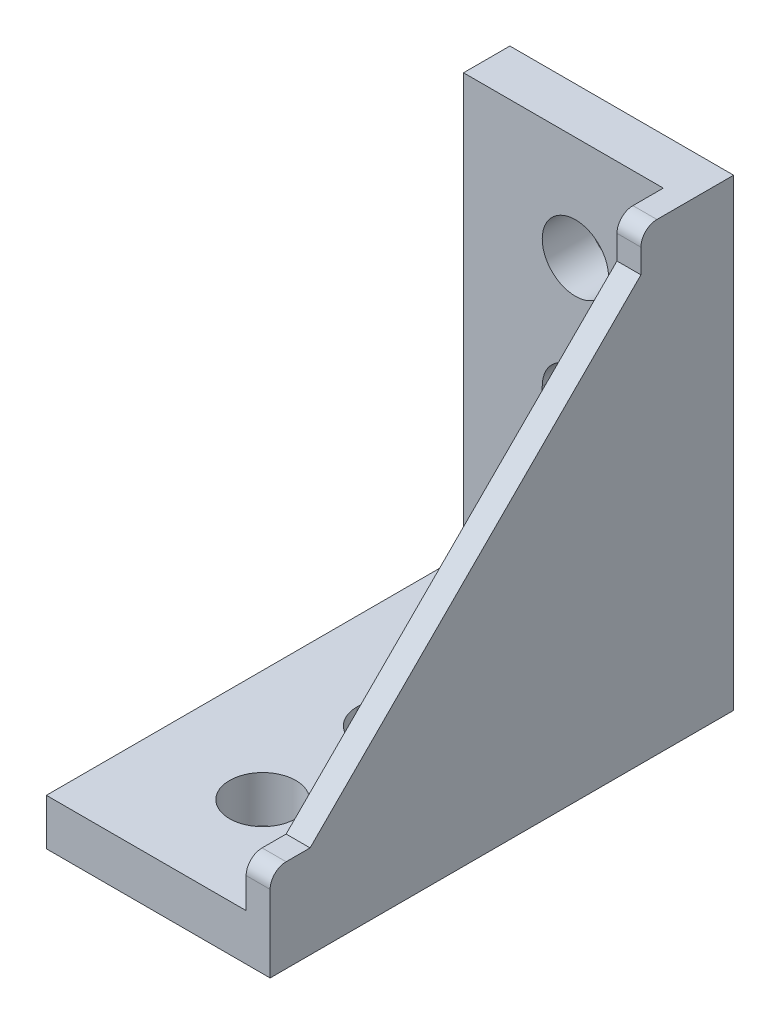
ISO-10303-21;
HEADER;
FILE_DESCRIPTION(('STEP AP214'),'2;1');
FILE_NAME('part.step','',(''),(''),'','','');
FILE_SCHEMA(('AUTOMOTIVE_DESIGN { 1 0 10303 214 1 1 1 1 }'));
ENDSEC;
DATA;
#1=APPLICATION_CONTEXT('core data for automotive mechanical design processes');
#2=APPLICATION_PROTOCOL_DEFINITION('international standard','automotive_design',2000,#1);
#3=PRODUCT_CONTEXT('',#1,'mechanical');
#4=PRODUCT('Part','Part','',(#3));
#5=PRODUCT_RELATED_PRODUCT_CATEGORY('part','',(#4));
#6=PRODUCT_DEFINITION_FORMATION('','',#4);
#7=PRODUCT_DEFINITION_CONTEXT('part definition',#1,'design');
#8=PRODUCT_DEFINITION('design','',#6,#7);
#9=PRODUCT_DEFINITION_SHAPE('','',#8);
#10=(LENGTH_UNIT() NAMED_UNIT(*) SI_UNIT(.MILLI.,.METRE.));
#11=(NAMED_UNIT(*) PLANE_ANGLE_UNIT() SI_UNIT($,.RADIAN.));
#12=(NAMED_UNIT(*) SI_UNIT($,.STERADIAN.) SOLID_ANGLE_UNIT());
#13=UNCERTAINTY_MEASURE_WITH_UNIT(LENGTH_MEASURE(1.E-05),#10,'distance_accuracy_value','');
#14=(GEOMETRIC_REPRESENTATION_CONTEXT(3) GLOBAL_UNCERTAINTY_ASSIGNED_CONTEXT((#13)) GLOBAL_UNIT_ASSIGNED_CONTEXT((#10,
#11,#12)) REPRESENTATION_CONTEXT('',''));
#15=CARTESIAN_POINT('',(0.,0.,0.));
#16=DIRECTION('',(0.,0.,1.));
#17=DIRECTION('',(1.,0.,0.));
#18=AXIS2_PLACEMENT_3D('',#15,#16,#17);
#19=CARTESIAN_POINT('',(14.,-29.,5.8));
#20=DIRECTION('',(0.,0.,1.));
#21=DIRECTION('',(1.,0.,0.));
#22=AXIS2_PLACEMENT_3D('',#19,#20,#21);
#23=PLANE('',#22);
#24=CARTESIAN_POINT('',(0.,15.929446332219,5.80000000000009));
#25=DIRECTION('',(0.,0.,-1.));
#26=DIRECTION('',(-1.,0.,0.));
#27=AXIS2_PLACEMENT_3D('',#24,#25,#26);
#28=CIRCLE('',#27,4.15);
#29=CARTESIAN_POINT('',(-4.15000000000002,15.929446332219,5.80000000000009));
#30=VERTEX_POINT('',#29);
#31=EDGE_CURVE('E201',#30,#30,#28,.T.);
#32=ORIENTED_EDGE('',*,*,#31,.T.);
#33=EDGE_LOOP('',(#32));
#34=FACE_BOUND('',#33,.T.);
#35=DIRECTION('',(0.,1.,0.));
#36=VECTOR('',#35,1.);
#37=CARTESIAN_POINT('',(11.,29.,5.8));
#38=LINE('',#37,#36);
#39=CARTESIAN_POINT('',(11.,-23.2,5.8));
#40=VERTEX_POINT('',#39);
#41=CARTESIAN_POINT('',(11.,29.,5.8));
#42=VERTEX_POINT('',#41);
#43=EDGE_CURVE('E249',#40,#42,#38,.T.);
#44=ORIENTED_EDGE('',*,*,#43,.T.);
#45=DIRECTION('',(-1.,0.,0.));
#46=VECTOR('',#45,1.);
#47=CARTESIAN_POINT('',(-14.,29.,5.8));
#48=LINE('',#47,#46);
#49=CARTESIAN_POINT('',(-14.,29.,5.8));
#50=VERTEX_POINT('',#49);
#51=EDGE_CURVE('E295',#42,#50,#48,.T.);
#52=ORIENTED_EDGE('',*,*,#51,.T.);
#53=DIRECTION('',(0.,-1.,0.));
#54=VECTOR('',#53,1.);
#55=CARTESIAN_POINT('',(-14.,29.,5.8));
#56=LINE('',#55,#54);
#57=CARTESIAN_POINT('',(-14.,-23.2,5.80000000000001));
#58=VERTEX_POINT('',#57);
#59=EDGE_CURVE('E297',#50,#58,#56,.T.);
#60=ORIENTED_EDGE('',*,*,#59,.T.);
#61=DIRECTION('',(-1.,0.,0.));
#62=VECTOR('',#61,1.);
#63=CARTESIAN_POINT('',(14.,-23.2,5.8));
#64=LINE('',#63,#62);
#65=EDGE_CURVE('E292',#40,#58,#64,.T.);
#66=ORIENTED_EDGE('',*,*,#65,.F.);
#67=EDGE_LOOP('',(#44,#52,#60,#66));
#68=FACE_BOUND('',#67,.T.);
#69=DIRECTION('',(0.,-1.,0.));
#70=VECTOR('',#69,1.);
#71=CARTESIAN_POINT('',(4.14999999999999,-11.7296029454166,5.80000000000003));
#72=LINE('',#71,#70);
#73=CARTESIAN_POINT('',(4.14999999999999,-0.0296029454166166,5.80000000000005));
#74=VERTEX_POINT('',#73);
#75=CARTESIAN_POINT('',(4.14999999999999,-11.7296029454166,5.8));
#76=VERTEX_POINT('',#75);
#77=EDGE_CURVE('E195',#74,#76,#72,.T.);
#78=ORIENTED_EDGE('',*,*,#77,.T.);
#79=CARTESIAN_POINT('',(0.,-11.7296029454166,5.80000000000003));
#80=DIRECTION('',(0.,0.,-1.));
#81=DIRECTION('',(-1.,0.,0.));
#82=AXIS2_PLACEMENT_3D('',#79,#80,#81);
#83=CIRCLE('',#82,4.15);
#84=CARTESIAN_POINT('',(-4.15000000000001,-11.7296029454166,5.80000000000003));
#85=VERTEX_POINT('',#84);
#86=EDGE_CURVE('E49',#76,#85,#83,.T.);
#87=ORIENTED_EDGE('',*,*,#86,.T.);
#88=DIRECTION('',(0.,1.,0.));
#89=VECTOR('',#88,1.);
#90=CARTESIAN_POINT('',(-4.15000000000001,-11.7296029454166,5.80000000000003));
#91=LINE('',#90,#89);
#92=CARTESIAN_POINT('',(-4.15000000000001,-0.0296029454166166,5.80000000000005));
#93=VERTEX_POINT('',#92);
#94=EDGE_CURVE('E186',#85,#93,#91,.T.);
#95=ORIENTED_EDGE('',*,*,#94,.T.);
#96=CARTESIAN_POINT('',(0.,-0.0296029454166166,5.80000000000005));
#97=DIRECTION('',(0.,0.,-1.));
#98=DIRECTION('',(-1.,0.,0.));
#99=AXIS2_PLACEMENT_3D('',#96,#97,#98);
#100=CIRCLE('',#99,4.15);
#101=EDGE_CURVE('E189',#93,#74,#100,.T.);
#102=ORIENTED_EDGE('',*,*,#101,.T.);
#103=EDGE_LOOP('',(#78,#87,#95,#102));
#104=FACE_BOUND('',#103,.T.);
#105=ADVANCED_FACE('F34',(#34,#68,#104),#23,.T.);
#106=CARTESIAN_POINT('',(14.,-29.,0.));
#107=DIRECTION('',(0.,0.,1.));
#108=DIRECTION('',(1.,0.,0.));
#109=AXIS2_PLACEMENT_3D('',#106,#107,#108);
#110=PLANE('',#109);
#111=CARTESIAN_POINT('',(0.,15.929446332219,0.));
#112=DIRECTION('',(0.,0.,-1.));
#113=DIRECTION('',(-1.,0.,0.));
#114=AXIS2_PLACEMENT_3D('',#111,#112,#113);
#115=CIRCLE('',#114,4.15);
#116=CARTESIAN_POINT('',(-4.15000000000002,15.929446332219,0.));
#117=VERTEX_POINT('',#116);
#118=EDGE_CURVE('E205',#117,#117,#115,.T.);
#119=ORIENTED_EDGE('',*,*,#118,.F.);
#120=EDGE_LOOP('',(#119));
#121=FACE_BOUND('',#120,.T.);
#122=DIRECTION('',(-1.,0.,0.));
#123=VECTOR('',#122,1.);
#124=CARTESIAN_POINT('',(-14.,29.,0.));
#125=LINE('',#124,#123);
#126=CARTESIAN_POINT('',(14.,29.,0.));
#127=VERTEX_POINT('',#126);
#128=CARTESIAN_POINT('',(-14.,29.,0.));
#129=VERTEX_POINT('',#128);
#130=EDGE_CURVE('E304',#127,#129,#125,.T.);
#131=ORIENTED_EDGE('',*,*,#130,.F.);
#132=DIRECTION('',(0.,1.,0.));
#133=VECTOR('',#132,1.);
#134=CARTESIAN_POINT('',(14.,29.,0.));
#135=LINE('',#134,#133);
#136=CARTESIAN_POINT('',(14.,-29.,0.));
#137=VERTEX_POINT('',#136);
#138=EDGE_CURVE('E294',#137,#127,#135,.T.);
#139=ORIENTED_EDGE('',*,*,#138,.F.);
#140=DIRECTION('',(1.,0.,0.));
#141=VECTOR('',#140,1.);
#142=CARTESIAN_POINT('',(-14.,-29.,0.));
#143=LINE('',#142,#141);
#144=CARTESIAN_POINT('',(-14.,-29.,0.));
#145=VERTEX_POINT('',#144);
#146=EDGE_CURVE('E298',#145,#137,#143,.T.);
#147=ORIENTED_EDGE('',*,*,#146,.F.);
#148=DIRECTION('',(0.,-1.,0.));
#149=VECTOR('',#148,1.);
#150=CARTESIAN_POINT('',(-14.,29.,0.));
#151=LINE('',#150,#149);
#152=EDGE_CURVE('E306',#129,#145,#151,.T.);
#153=ORIENTED_EDGE('',*,*,#152,.F.);
#154=EDGE_LOOP('',(#131,#139,#147,#153));
#155=FACE_BOUND('',#154,.T.);
#156=CARTESIAN_POINT('',(0.,-11.7296029454166,0.));
#157=DIRECTION('',(0.,0.,-1.));
#158=DIRECTION('',(-1.,0.,0.));
#159=AXIS2_PLACEMENT_3D('',#156,#157,#158);
#160=CIRCLE('',#159,4.15);
#161=CARTESIAN_POINT('',(4.14999999999999,-11.7296029454166,0.));
#162=VERTEX_POINT('',#161);
#163=CARTESIAN_POINT('',(-4.15000000000001,-11.7296029454166,0.));
#164=VERTEX_POINT('',#163);
#165=EDGE_CURVE('E178',#162,#164,#160,.T.);
#166=ORIENTED_EDGE('',*,*,#165,.F.);
#167=DIRECTION('',(0.,-1.,0.));
#168=VECTOR('',#167,1.);
#169=CARTESIAN_POINT('',(4.14999999999999,-11.7296029454166,0.));
#170=LINE('',#169,#168);
#171=CARTESIAN_POINT('',(4.14999999999999,-0.0296029454166027,0.));
#172=VERTEX_POINT('',#171);
#173=EDGE_CURVE('E170',#172,#162,#170,.T.);
#174=ORIENTED_EDGE('',*,*,#173,.F.);
#175=CARTESIAN_POINT('',(0.,-0.0296029454166025,0.));
#176=DIRECTION('',(0.,0.,-1.));
#177=DIRECTION('',(-1.,0.,0.));
#178=AXIS2_PLACEMENT_3D('',#175,#176,#177);
#179=CIRCLE('',#178,4.15);
#180=CARTESIAN_POINT('',(-4.15000000000001,-0.0296029454166025,0.));
#181=VERTEX_POINT('',#180);
#182=EDGE_CURVE('E177',#181,#172,#179,.T.);
#183=ORIENTED_EDGE('',*,*,#182,.F.);
#184=DIRECTION('',(0.,1.,0.));
#185=VECTOR('',#184,1.);
#186=CARTESIAN_POINT('',(-4.15000000000001,-11.7296029454166,0.));
#187=LINE('',#186,#185);
#188=EDGE_CURVE('E182',#164,#181,#187,.T.);
#189=ORIENTED_EDGE('',*,*,#188,.F.);
#190=EDGE_LOOP('',(#166,#174,#183,#189));
#191=FACE_BOUND('',#190,.T.);
#192=ADVANCED_FACE('F185',(#121,#155,#191),#110,.F.);
#193=CARTESIAN_POINT('',(14.,29.,5.8));
#194=DIRECTION('',(-1.,0.,0.));
#195=DIRECTION('',(0.,-1.,0.));
#196=AXIS2_PLACEMENT_3D('',#193,#194,#195);
#197=PLANE('',#196);
#198=DIRECTION('',(0.,0.,-1.));
#199=VECTOR('',#198,1.);
#200=CARTESIAN_POINT('',(14.,29.,5.8));
#201=LINE('',#200,#199);
#202=CARTESIAN_POINT('',(14.,29.,9.6));
#203=VERTEX_POINT('',#202);
#204=EDGE_CURVE('E317',#203,#127,#201,.T.);
#205=ORIENTED_EDGE('',*,*,#204,.F.);
#206=CARTESIAN_POINT('',(14.,27.,9.6));
#207=DIRECTION('',(-1.,0.,0.));
#208=DIRECTION('',(0.,-1.,0.));
#209=AXIS2_PLACEMENT_3D('',#206,#207,#208);
#210=CIRCLE('',#209,2.);
#211=CARTESIAN_POINT('',(14.,27.,11.6));
#212=VERTEX_POINT('',#211);
#213=EDGE_CURVE('E324',#203,#212,#210,.F.);
#214=ORIENTED_EDGE('',*,*,#213,.T.);
#215=DIRECTION('',(0.,-1.,0.));
#216=VECTOR('',#215,1.);
#217=CARTESIAN_POINT('',(14.,29.,11.6));
#218=LINE('',#217,#216);
#219=CARTESIAN_POINT('',(14.,24.,11.6));
#220=VERTEX_POINT('',#219);
#221=EDGE_CURVE('E246',#212,#220,#218,.T.);
#222=ORIENTED_EDGE('',*,*,#221,.T.);
#223=DIRECTION('',(0.,-0.707106781186547,0.707106781186547));
#224=VECTOR('',#223,1.);
#225=CARTESIAN_POINT('',(14.,24.,11.6));
#226=LINE('',#225,#224);
#227=CARTESIAN_POINT('',(14.,-17.4,53.));
#228=VERTEX_POINT('',#227);
#229=EDGE_CURVE('E269',#220,#228,#226,.T.);
#230=ORIENTED_EDGE('',*,*,#229,.T.);
#231=DIRECTION('',(0.,0.,1.));
#232=VECTOR('',#231,1.);
#233=CARTESIAN_POINT('',(14.,-17.4,53.));
#234=LINE('',#233,#232);
#235=CARTESIAN_POINT('',(14.,-17.4,56.));
#236=VERTEX_POINT('',#235);
#237=EDGE_CURVE('E252',#228,#236,#234,.T.);
#238=ORIENTED_EDGE('',*,*,#237,.T.);
#239=CARTESIAN_POINT('',(14.,-19.4,56.));
#240=DIRECTION('',(-1.,0.,0.));
#241=DIRECTION('',(0.,-1.,0.));
#242=AXIS2_PLACEMENT_3D('',#239,#240,#241);
#243=CIRCLE('',#242,2.);
#244=CARTESIAN_POINT('',(14.,-19.4,58.));
#245=VERTEX_POINT('',#244);
#246=EDGE_CURVE('E322',#236,#245,#243,.F.);
#247=ORIENTED_EDGE('',*,*,#246,.T.);
#248=DIRECTION('',(0.,-1.,0.));
#249=VECTOR('',#248,1.);
#250=CARTESIAN_POINT('',(14.,-29.,58.));
#251=LINE('',#250,#249);
#252=CARTESIAN_POINT('',(14.,-29.,58.));
#253=VERTEX_POINT('',#252);
#254=EDGE_CURVE('E284',#245,#253,#251,.T.);
#255=ORIENTED_EDGE('',*,*,#254,.T.);
#256=DIRECTION('',(0.,0.,-1.));
#257=VECTOR('',#256,1.);
#258=CARTESIAN_POINT('',(14.,-29.,5.8));
#259=LINE('',#258,#257);
#260=EDGE_CURVE('E301',#253,#137,#259,.T.);
#261=ORIENTED_EDGE('',*,*,#260,.T.);
#262=ORIENTED_EDGE('',*,*,#138,.T.);
#263=EDGE_LOOP('',(#205,#214,#222,#230,#238,#247,#255,#261,#262));
#264=FACE_BOUND('',#263,.T.);
#265=ADVANCED_FACE('F341',(#264),#197,.F.);
#266=CARTESIAN_POINT('',(-14.,29.,5.8));
#267=DIRECTION('',(0.,-1.,0.));
#268=DIRECTION('',(0.,0.,-1.));
#269=AXIS2_PLACEMENT_3D('',#266,#267,#268);
#270=PLANE('',#269);
#271=DIRECTION('',(0.,0.,1.));
#272=VECTOR('',#271,1.);
#273=CARTESIAN_POINT('',(11.,29.,5.8));
#274=LINE('',#273,#272);
#275=CARTESIAN_POINT('',(11.,29.,9.6));
#276=VERTEX_POINT('',#275);
#277=EDGE_CURVE('E251',#42,#276,#274,.T.);
#278=ORIENTED_EDGE('',*,*,#277,.T.);
#279=DIRECTION('',(1.,0.,0.));
#280=VECTOR('',#279,1.);
#281=CARTESIAN_POINT('',(14.,29.,9.6));
#282=LINE('',#281,#280);
#283=EDGE_CURVE('E319',#276,#203,#282,.T.);
#284=ORIENTED_EDGE('',*,*,#283,.T.);
#285=ORIENTED_EDGE('',*,*,#204,.T.);
#286=ORIENTED_EDGE('',*,*,#130,.T.);
#287=DIRECTION('',(0.,0.,-1.));
#288=VECTOR('',#287,1.);
#289=CARTESIAN_POINT('',(-14.,29.,5.8));
#290=LINE('',#289,#288);
#291=EDGE_CURVE('E314',#50,#129,#290,.T.);
#292=ORIENTED_EDGE('',*,*,#291,.F.);
#293=ORIENTED_EDGE('',*,*,#51,.F.);
#294=EDGE_LOOP('',(#278,#284,#285,#286,#292,#293));
#295=FACE_BOUND('',#294,.T.);
#296=ADVANCED_FACE('F369',(#295),#270,.F.);
#297=CARTESIAN_POINT('',(-14.,29.,5.8));
#298=DIRECTION('',(1.,0.,0.));
#299=DIRECTION('',(0.,1.,0.));
#300=AXIS2_PLACEMENT_3D('',#297,#298,#299);
#301=PLANE('',#300);
#302=ORIENTED_EDGE('',*,*,#152,.T.);
#303=DIRECTION('',(0.,0.,-1.));
#304=VECTOR('',#303,1.);
#305=CARTESIAN_POINT('',(-14.,-29.,5.8));
#306=LINE('',#305,#304);
#307=CARTESIAN_POINT('',(-14.,-29.,58.));
#308=VERTEX_POINT('',#307);
#309=EDGE_CURVE('E311',#308,#145,#306,.T.);
#310=ORIENTED_EDGE('',*,*,#309,.F.);
#311=DIRECTION('',(0.,1.,0.));
#312=VECTOR('',#311,1.);
#313=CARTESIAN_POINT('',(-14.,-29.,58.));
#314=LINE('',#313,#312);
#315=CARTESIAN_POINT('',(-14.,-23.2,58.));
#316=VERTEX_POINT('',#315);
#317=EDGE_CURVE('E276',#308,#316,#314,.T.);
#318=ORIENTED_EDGE('',*,*,#317,.T.);
#319=DIRECTION('',(0.,0.,-1.));
#320=VECTOR('',#319,1.);
#321=CARTESIAN_POINT('',(-14.,-23.2,58.));
#322=LINE('',#321,#320);
#323=EDGE_CURVE('E289',#316,#58,#322,.T.);
#324=ORIENTED_EDGE('',*,*,#323,.T.);
#325=ORIENTED_EDGE('',*,*,#59,.F.);
#326=ORIENTED_EDGE('',*,*,#291,.T.);
#327=EDGE_LOOP('',(#302,#310,#318,#324,#325,#326));
#328=FACE_BOUND('',#327,.T.);
#329=ADVANCED_FACE('F386',(#328),#301,.F.);
#330=CARTESIAN_POINT('',(-14.,-29.,5.8));
#331=DIRECTION('',(0.,1.,0.));
#332=DIRECTION('',(0.,0.,1.));
#333=AXIS2_PLACEMENT_3D('',#330,#331,#332);
#334=PLANE('',#333);
#335=DIRECTION('',(0.,0.,-1.));
#336=VECTOR('',#335,1.);
#337=CARTESIAN_POINT('',(4.15,-29.,17.2703970545834));
#338=LINE('',#337,#336);
#339=CARTESIAN_POINT('',(4.15,-29.,28.9703970545834));
#340=VERTEX_POINT('',#339);
#341=CARTESIAN_POINT('',(4.15,-29.,17.2703970545834));
#342=VERTEX_POINT('',#341);
#343=EDGE_CURVE('E221',#340,#342,#338,.T.);
#344=ORIENTED_EDGE('',*,*,#343,.T.);
#345=CARTESIAN_POINT('',(0.,-29.,17.2703970545834));
#346=DIRECTION('',(0.,1.,0.));
#347=DIRECTION('',(-1.,0.,0.));
#348=AXIS2_PLACEMENT_3D('',#345,#346,#347);
#349=CIRCLE('',#348,4.15);
#350=CARTESIAN_POINT('',(-4.15000000000001,-29.,17.2703970545834));
#351=VERTEX_POINT('',#350);
#352=EDGE_CURVE('E211',#342,#351,#349,.T.);
#353=ORIENTED_EDGE('',*,*,#352,.T.);
#354=DIRECTION('',(0.,0.,1.));
#355=VECTOR('',#354,1.);
#356=CARTESIAN_POINT('',(-4.15000000000001,-29.,17.2703970545834));
#357=LINE('',#356,#355);
#358=CARTESIAN_POINT('',(-4.15,-29.,28.9703970545834));
#359=VERTEX_POINT('',#358);
#360=EDGE_CURVE('E214',#351,#359,#357,.T.);
#361=ORIENTED_EDGE('',*,*,#360,.T.);
#362=CARTESIAN_POINT('',(0.,-29.,28.9703970545834));
#363=DIRECTION('',(0.,1.,0.));
#364=DIRECTION('',(-1.,0.,0.));
#365=AXIS2_PLACEMENT_3D('',#362,#363,#364);
#366=CIRCLE('',#365,4.15);
#367=EDGE_CURVE('E218',#359,#340,#366,.T.);
#368=ORIENTED_EDGE('',*,*,#367,.T.);
#369=EDGE_LOOP('',(#344,#353,#361,#368));
#370=FACE_BOUND('',#369,.T.);
#371=CARTESIAN_POINT('',(0.,-29.,44.929446332219));
#372=DIRECTION('',(0.,1.,0.));
#373=DIRECTION('',(-1.,0.,0.));
#374=AXIS2_PLACEMENT_3D('',#371,#372,#373);
#375=CIRCLE('',#374,4.15);
#376=CARTESIAN_POINT('',(-4.15,-29.,44.929446332219));
#377=VERTEX_POINT('',#376);
#378=EDGE_CURVE('E243',#377,#377,#375,.T.);
#379=ORIENTED_EDGE('',*,*,#378,.T.);
#380=EDGE_LOOP('',(#379));
#381=FACE_BOUND('',#380,.T.);
#382=ORIENTED_EDGE('',*,*,#146,.T.);
#383=ORIENTED_EDGE('',*,*,#260,.F.);
#384=DIRECTION('',(-1.,0.,0.));
#385=VECTOR('',#384,1.);
#386=CARTESIAN_POINT('',(-14.,-29.,58.));
#387=LINE('',#386,#385);
#388=EDGE_CURVE('E286',#253,#308,#387,.T.);
#389=ORIENTED_EDGE('',*,*,#388,.T.);
#390=ORIENTED_EDGE('',*,*,#309,.T.);
#391=EDGE_LOOP('',(#382,#383,#389,#390));
#392=FACE_BOUND('',#391,.T.);
#393=ADVANCED_FACE('F363',(#370,#381,#392),#334,.F.);
#394=CARTESIAN_POINT('',(-14.,-23.2,58.));
#395=DIRECTION('',(0.,1.,0.));
#396=DIRECTION('',(-1.,0.,0.));
#397=AXIS2_PLACEMENT_3D('',#394,#395,#396);
#398=PLANE('',#397);
#399=CARTESIAN_POINT('',(0.,-23.2,17.2703970545834));
#400=DIRECTION('',(0.,1.,0.));
#401=DIRECTION('',(-1.,0.,0.));
#402=AXIS2_PLACEMENT_3D('',#399,#400,#401);
#403=CIRCLE('',#402,4.15);
#404=CARTESIAN_POINT('',(4.15,-23.2,17.2703970545834));
#405=VERTEX_POINT('',#404);
#406=CARTESIAN_POINT('',(-4.15000000000001,-23.2,17.2703970545834));
#407=VERTEX_POINT('',#406);
#408=EDGE_CURVE('E208',#405,#407,#403,.T.);
#409=ORIENTED_EDGE('',*,*,#408,.F.);
#410=DIRECTION('',(0.,0.,-1.));
#411=VECTOR('',#410,1.);
#412=CARTESIAN_POINT('',(4.15,-23.2,17.2703970545834));
#413=LINE('',#412,#411);
#414=CARTESIAN_POINT('',(4.15,-23.2,28.9703970545834));
#415=VERTEX_POINT('',#414);
#416=EDGE_CURVE('E215',#415,#405,#413,.T.);
#417=ORIENTED_EDGE('',*,*,#416,.F.);
#418=CARTESIAN_POINT('',(0.,-23.2,28.9703970545834));
#419=DIRECTION('',(0.,1.,0.));
#420=DIRECTION('',(-1.,0.,0.));
#421=AXIS2_PLACEMENT_3D('',#418,#419,#420);
#422=CIRCLE('',#421,4.15);
#423=CARTESIAN_POINT('',(-4.15,-23.2,28.9703970545834));
#424=VERTEX_POINT('',#423);
#425=EDGE_CURVE('E229',#424,#415,#422,.T.);
#426=ORIENTED_EDGE('',*,*,#425,.F.);
#427=DIRECTION('',(0.,0.,1.));
#428=VECTOR('',#427,1.);
#429=CARTESIAN_POINT('',(-4.15000000000001,-23.2,17.2703970545834));
#430=LINE('',#429,#428);
#431=EDGE_CURVE('E226',#407,#424,#430,.T.);
#432=ORIENTED_EDGE('',*,*,#431,.F.);
#433=EDGE_LOOP('',(#409,#417,#426,#432));
#434=FACE_BOUND('',#433,.T.);
#435=CARTESIAN_POINT('',(0.,-23.2,44.929446332219));
#436=DIRECTION('',(0.,1.,0.));
#437=DIRECTION('',(-1.,0.,0.));
#438=AXIS2_PLACEMENT_3D('',#435,#436,#437);
#439=CIRCLE('',#438,4.15);
#440=CARTESIAN_POINT('',(-4.15,-23.2,44.929446332219));
#441=VERTEX_POINT('',#440);
#442=EDGE_CURVE('E236',#441,#441,#439,.T.);
#443=ORIENTED_EDGE('',*,*,#442,.F.);
#444=EDGE_LOOP('',(#443));
#445=FACE_BOUND('',#444,.T.);
#446=DIRECTION('',(0.,0.,-1.));
#447=VECTOR('',#446,1.);
#448=CARTESIAN_POINT('',(11.,-23.2,5.8));
#449=LINE('',#448,#447);
#450=CARTESIAN_POINT('',(11.,-23.2,58.));
#451=VERTEX_POINT('',#450);
#452=EDGE_CURVE('E265',#451,#40,#449,.T.);
#453=ORIENTED_EDGE('',*,*,#452,.T.);
#454=ORIENTED_EDGE('',*,*,#65,.T.);
#455=ORIENTED_EDGE('',*,*,#323,.F.);
#456=DIRECTION('',(1.,0.,0.));
#457=VECTOR('',#456,1.);
#458=CARTESIAN_POINT('',(-14.,-23.2,58.));
#459=LINE('',#458,#457);
#460=EDGE_CURVE('E281',#316,#451,#459,.T.);
#461=ORIENTED_EDGE('',*,*,#460,.T.);
#462=EDGE_LOOP('',(#453,#454,#455,#461));
#463=FACE_BOUND('',#462,.T.);
#464=ADVANCED_FACE('F388',(#434,#445,#463),#398,.T.);
#465=CARTESIAN_POINT('',(-14.,-23.2,58.));
#466=DIRECTION('',(0.,0.,-1.));
#467=DIRECTION('',(-1.,0.,0.));
#468=AXIS2_PLACEMENT_3D('',#465,#466,#467);
#469=PLANE('',#468);
#470=ORIENTED_EDGE('',*,*,#254,.F.);
#471=DIRECTION('',(1.,0.,0.));
#472=VECTOR('',#471,1.);
#473=CARTESIAN_POINT('',(11.,-19.4,58.));
#474=LINE('',#473,#472);
#475=CARTESIAN_POINT('',(11.,-19.4,58.));
#476=VERTEX_POINT('',#475);
#477=EDGE_CURVE('E11',#245,#476,#474,.F.);
#478=ORIENTED_EDGE('',*,*,#477,.T.);
#479=DIRECTION('',(0.,-1.,0.));
#480=VECTOR('',#479,1.);
#481=CARTESIAN_POINT('',(11.,-17.4,58.));
#482=LINE('',#481,#480);
#483=EDGE_CURVE('E263',#476,#451,#482,.T.);
#484=ORIENTED_EDGE('',*,*,#483,.T.);
#485=ORIENTED_EDGE('',*,*,#460,.F.);
#486=ORIENTED_EDGE('',*,*,#317,.F.);
#487=ORIENTED_EDGE('',*,*,#388,.F.);
#488=EDGE_LOOP('',(#470,#478,#484,#485,#486,#487));
#489=FACE_BOUND('',#488,.T.);
#490=ADVANCED_FACE('F356',(#489),#469,.F.);
#491=CARTESIAN_POINT('',(11.,-17.4,53.));
#492=DIRECTION('',(0.,1.,0.));
#493=DIRECTION('',(-1.,0.,0.));
#494=AXIS2_PLACEMENT_3D('',#491,#492,#493);
#495=PLANE('',#494);
#496=DIRECTION('',(0.,0.,1.));
#497=VECTOR('',#496,1.);
#498=CARTESIAN_POINT('',(11.,-17.4,53.));
#499=LINE('',#498,#497);
#500=CARTESIAN_POINT('',(11.,-17.4,53.));
#501=VERTEX_POINT('',#500);
#502=CARTESIAN_POINT('',(11.,-17.4,56.));
#503=VERTEX_POINT('',#502);
#504=EDGE_CURVE('E260',#501,#503,#499,.T.);
#505=ORIENTED_EDGE('',*,*,#504,.T.);
#506=DIRECTION('',(1.,0.,0.));
#507=VECTOR('',#506,1.);
#508=CARTESIAN_POINT('',(14.,-17.4,56.));
#509=LINE('',#508,#507);
#510=EDGE_CURVE('E42',#503,#236,#509,.T.);
#511=ORIENTED_EDGE('',*,*,#510,.T.);
#512=ORIENTED_EDGE('',*,*,#237,.F.);
#513=DIRECTION('',(1.,0.,0.));
#514=VECTOR('',#513,1.);
#515=CARTESIAN_POINT('',(11.,-17.4,53.));
#516=LINE('',#515,#514);
#517=EDGE_CURVE('E274',#501,#228,#516,.T.);
#518=ORIENTED_EDGE('',*,*,#517,.F.);
#519=EDGE_LOOP('',(#505,#511,#512,#518));
#520=FACE_BOUND('',#519,.T.);
#521=ADVANCED_FACE('F335',(#520),#495,.T.);
#522=CARTESIAN_POINT('',(11.,24.,11.6));
#523=DIRECTION('',(0.,0.707106781186548,0.707106781186548));
#524=DIRECTION('',(0.,-0.707106781186548,0.707106781186548));
#525=AXIS2_PLACEMENT_3D('',#522,#523,#524);
#526=PLANE('',#525);
#527=ORIENTED_EDGE('',*,*,#229,.F.);
#528=DIRECTION('',(1.,0.,0.));
#529=VECTOR('',#528,1.);
#530=CARTESIAN_POINT('',(11.,24.,11.6));
#531=LINE('',#530,#529);
#532=CARTESIAN_POINT('',(11.,24.,11.6));
#533=VERTEX_POINT('',#532);
#534=EDGE_CURVE('E267',#533,#220,#531,.T.);
#535=ORIENTED_EDGE('',*,*,#534,.F.);
#536=DIRECTION('',(0.,-0.707106781186547,0.707106781186547));
#537=VECTOR('',#536,1.);
#538=CARTESIAN_POINT('',(11.,24.,11.6));
#539=LINE('',#538,#537);
#540=EDGE_CURVE('E257',#533,#501,#539,.T.);
#541=ORIENTED_EDGE('',*,*,#540,.T.);
#542=ORIENTED_EDGE('',*,*,#517,.T.);
#543=EDGE_LOOP('',(#527,#535,#541,#542));
#544=FACE_BOUND('',#543,.T.);
#545=ADVANCED_FACE('F347',(#544),#526,.T.);
#546=CARTESIAN_POINT('',(11.,29.,11.6));
#547=DIRECTION('',(0.,0.,1.));
#548=DIRECTION('',(1.,0.,0.));
#549=AXIS2_PLACEMENT_3D('',#546,#547,#548);
#550=PLANE('',#549);
#551=ORIENTED_EDGE('',*,*,#221,.F.);
#552=DIRECTION('',(1.,0.,0.));
#553=VECTOR('',#552,1.);
#554=CARTESIAN_POINT('',(11.,27.,11.6));
#555=LINE('',#554,#553);
#556=CARTESIAN_POINT('',(11.,27.,11.6));
#557=VERTEX_POINT('',#556);
#558=EDGE_CURVE('E326',#212,#557,#555,.F.);
#559=ORIENTED_EDGE('',*,*,#558,.T.);
#560=DIRECTION('',(0.,-1.,0.));
#561=VECTOR('',#560,1.);
#562=CARTESIAN_POINT('',(11.,29.,11.6));
#563=LINE('',#562,#561);
#564=EDGE_CURVE('E255',#557,#533,#563,.T.);
#565=ORIENTED_EDGE('',*,*,#564,.T.);
#566=ORIENTED_EDGE('',*,*,#534,.T.);
#567=EDGE_LOOP('',(#551,#559,#565,#566));
#568=FACE_BOUND('',#567,.T.);
#569=ADVANCED_FACE('F379',(#568),#550,.T.);
#570=CARTESIAN_POINT('',(11.,-23.2,5.8));
#571=DIRECTION('',(-1.,0.,0.));
#572=DIRECTION('',(0.,-1.,0.));
#573=AXIS2_PLACEMENT_3D('',#570,#571,#572);
#574=PLANE('',#573);
#575=ORIENTED_EDGE('',*,*,#564,.F.);
#576=CARTESIAN_POINT('',(11.,27.,9.6));
#577=DIRECTION('',(-1.,0.,0.));
#578=DIRECTION('',(0.,-1.,0.));
#579=AXIS2_PLACEMENT_3D('',#576,#577,#578);
#580=CIRCLE('',#579,2.);
#581=EDGE_CURVE('E330',#557,#276,#580,.T.);
#582=ORIENTED_EDGE('',*,*,#581,.T.);
#583=ORIENTED_EDGE('',*,*,#277,.F.);
#584=ORIENTED_EDGE('',*,*,#43,.F.);
#585=ORIENTED_EDGE('',*,*,#452,.F.);
#586=ORIENTED_EDGE('',*,*,#483,.F.);
#587=CARTESIAN_POINT('',(11.,-19.4,56.));
#588=DIRECTION('',(-1.,0.,0.));
#589=DIRECTION('',(0.,-1.,0.));
#590=AXIS2_PLACEMENT_3D('',#587,#588,#589);
#591=CIRCLE('',#590,2.);
#592=EDGE_CURVE('E328',#476,#503,#591,.T.);
#593=ORIENTED_EDGE('',*,*,#592,.T.);
#594=ORIENTED_EDGE('',*,*,#504,.F.);
#595=ORIENTED_EDGE('',*,*,#540,.F.);
#596=EDGE_LOOP('',(#575,#582,#583,#584,#585,#586,#593,#594,#595));
#597=FACE_BOUND('',#596,.T.);
#598=ADVANCED_FACE('F351',(#597),#574,.T.);
#599=CARTESIAN_POINT('',(-14.,27.,9.6));
#600=DIRECTION('',(-1.,0.,0.));
#601=DIRECTION('',(0.,0.,1.));
#602=AXIS2_PLACEMENT_3D('',#599,#600,#601);
#603=CYLINDRICAL_SURFACE('',#602,2.);
#604=ORIENTED_EDGE('',*,*,#581,.F.);
#605=ORIENTED_EDGE('',*,*,#558,.F.);
#606=ORIENTED_EDGE('',*,*,#213,.F.);
#607=ORIENTED_EDGE('',*,*,#283,.F.);
#608=EDGE_LOOP('',(#604,#605,#606,#607));
#609=FACE_BOUND('',#608,.T.);
#610=ADVANCED_FACE('F376',(#609),#603,.T.);
#611=CARTESIAN_POINT('',(11.,-19.4,56.));
#612=DIRECTION('',(-1.,0.,0.));
#613=DIRECTION('',(0.,-1.,0.));
#614=AXIS2_PLACEMENT_3D('',#611,#612,#613);
#615=CYLINDRICAL_SURFACE('',#614,2.);
#616=ORIENTED_EDGE('',*,*,#592,.F.);
#617=ORIENTED_EDGE('',*,*,#477,.F.);
#618=ORIENTED_EDGE('',*,*,#246,.F.);
#619=ORIENTED_EDGE('',*,*,#510,.F.);
#620=EDGE_LOOP('',(#616,#617,#618,#619));
#621=FACE_BOUND('',#620,.T.);
#622=ADVANCED_FACE('F36',(#621),#615,.T.);
#623=CARTESIAN_POINT('',(0.,-29.,44.929446332219));
#624=DIRECTION('',(0.,1.,0.));
#625=DIRECTION('',(-1.,0.,0.));
#626=AXIS2_PLACEMENT_3D('',#623,#624,#625);
#627=CYLINDRICAL_SURFACE('',#626,4.15);
#628=ORIENTED_EDGE('',*,*,#378,.F.);
#629=EDGE_LOOP('',(#628));
#630=FACE_BOUND('',#629,.T.);
#631=ORIENTED_EDGE('',*,*,#442,.T.);
#632=EDGE_LOOP('',(#631));
#633=FACE_BOUND('',#632,.T.);
#634=ADVANCED_FACE('F420',(#630,#633),#627,.F.);
#635=CARTESIAN_POINT('',(0.,-29.,17.2703970545834));
#636=DIRECTION('',(0.,1.,0.));
#637=DIRECTION('',(-1.,0.,0.));
#638=AXIS2_PLACEMENT_3D('',#635,#636,#637);
#639=CYLINDRICAL_SURFACE('',#638,4.15);
#640=ORIENTED_EDGE('',*,*,#408,.T.);
#641=DIRECTION('',(0.,1.,0.));
#642=VECTOR('',#641,1.);
#643=CARTESIAN_POINT('',(-4.15000000000001,-29.,17.2703970545834));
#644=LINE('',#643,#642);
#645=EDGE_CURVE('E224',#351,#407,#644,.T.);
#646=ORIENTED_EDGE('',*,*,#645,.F.);
#647=ORIENTED_EDGE('',*,*,#352,.F.);
#648=DIRECTION('',(0.,1.,0.));
#649=VECTOR('',#648,1.);
#650=CARTESIAN_POINT('',(4.15,-29.,17.2703970545834));
#651=LINE('',#650,#649);
#652=EDGE_CURVE('E234',#342,#405,#651,.T.);
#653=ORIENTED_EDGE('',*,*,#652,.T.);
#654=EDGE_LOOP('',(#640,#646,#647,#653));
#655=FACE_BOUND('',#654,.T.);
#656=ADVANCED_FACE('F481',(#655),#639,.F.);
#657=CARTESIAN_POINT('',(4.15,-29.,17.2703970545834));
#658=DIRECTION('',(1.,0.,0.));
#659=DIRECTION('',(0.,1.,0.));
#660=AXIS2_PLACEMENT_3D('',#657,#658,#659);
#661=PLANE('',#660);
#662=ORIENTED_EDGE('',*,*,#416,.T.);
#663=ORIENTED_EDGE('',*,*,#652,.F.);
#664=ORIENTED_EDGE('',*,*,#343,.F.);
#665=DIRECTION('',(0.,1.,0.));
#666=VECTOR('',#665,1.);
#667=CARTESIAN_POINT('',(4.15,-29.,28.9703970545834));
#668=LINE('',#667,#666);
#669=EDGE_CURVE('E237',#340,#415,#668,.T.);
#670=ORIENTED_EDGE('',*,*,#669,.T.);
#671=EDGE_LOOP('',(#662,#663,#664,#670));
#672=FACE_BOUND('',#671,.T.);
#673=ADVANCED_FACE('F490',(#672),#661,.F.);
#674=CARTESIAN_POINT('',(0.,-29.,28.9703970545834));
#675=DIRECTION('',(0.,1.,0.));
#676=DIRECTION('',(-1.,0.,0.));
#677=AXIS2_PLACEMENT_3D('',#674,#675,#676);
#678=CYLINDRICAL_SURFACE('',#677,4.15);
#679=ORIENTED_EDGE('',*,*,#425,.T.);
#680=ORIENTED_EDGE('',*,*,#669,.F.);
#681=ORIENTED_EDGE('',*,*,#367,.F.);
#682=DIRECTION('',(0.,1.,0.));
#683=VECTOR('',#682,1.);
#684=CARTESIAN_POINT('',(-4.15,-29.,28.9703970545834));
#685=LINE('',#684,#683);
#686=EDGE_CURVE('E239',#359,#424,#685,.T.);
#687=ORIENTED_EDGE('',*,*,#686,.T.);
#688=EDGE_LOOP('',(#679,#680,#681,#687));
#689=FACE_BOUND('',#688,.T.);
#690=ADVANCED_FACE('F499',(#689),#678,.F.);
#691=CARTESIAN_POINT('',(-4.15000000000001,-29.,17.2703970545834));
#692=DIRECTION('',(-1.,0.,0.));
#693=DIRECTION('',(0.,0.,1.));
#694=AXIS2_PLACEMENT_3D('',#691,#692,#693);
#695=PLANE('',#694);
#696=ORIENTED_EDGE('',*,*,#431,.T.);
#697=ORIENTED_EDGE('',*,*,#686,.F.);
#698=ORIENTED_EDGE('',*,*,#360,.F.);
#699=ORIENTED_EDGE('',*,*,#645,.T.);
#700=EDGE_LOOP('',(#696,#697,#698,#699));
#701=FACE_BOUND('',#700,.T.);
#702=ADVANCED_FACE('F509',(#701),#695,.F.);
#703=CARTESIAN_POINT('',(0.,15.929446332219,0.));
#704=DIRECTION('',(0.,0.,1.));
#705=DIRECTION('',(0.,-1.,0.));
#706=AXIS2_PLACEMENT_3D('',#703,#704,#705);
#707=CYLINDRICAL_SURFACE('',#706,4.15);
#708=ORIENTED_EDGE('',*,*,#118,.T.);
#709=EDGE_LOOP('',(#708));
#710=FACE_BOUND('',#709,.T.);
#711=ORIENTED_EDGE('',*,*,#31,.F.);
#712=EDGE_LOOP('',(#711));
#713=FACE_BOUND('',#712,.T.);
#714=ADVANCED_FACE('F518',(#710,#713),#707,.F.);
#715=CARTESIAN_POINT('',(0.,-11.7296029454166,0.));
#716=DIRECTION('',(0.,0.,1.));
#717=DIRECTION('',(0.,-1.,0.));
#718=AXIS2_PLACEMENT_3D('',#715,#716,#717);
#719=CYLINDRICAL_SURFACE('',#718,4.15);
#720=ORIENTED_EDGE('',*,*,#86,.F.);
#721=DIRECTION('',(0.,0.,1.));
#722=VECTOR('',#721,1.);
#723=CARTESIAN_POINT('',(4.14999999999999,-11.7296029454166,0.));
#724=LINE('',#723,#722);
#725=EDGE_CURVE('E172',#162,#76,#724,.T.);
#726=ORIENTED_EDGE('',*,*,#725,.F.);
#727=ORIENTED_EDGE('',*,*,#165,.T.);
#728=DIRECTION('',(0.,0.,1.));
#729=VECTOR('',#728,1.);
#730=CARTESIAN_POINT('',(-4.15000000000001,-11.7296029454166,0.));
#731=LINE('',#730,#729);
#732=EDGE_CURVE('E199',#164,#85,#731,.T.);
#733=ORIENTED_EDGE('',*,*,#732,.T.);
#734=EDGE_LOOP('',(#720,#726,#727,#733));
#735=FACE_BOUND('',#734,.T.);
#736=ADVANCED_FACE('F180',(#735),#719,.F.);
#737=CARTESIAN_POINT('',(-4.15000000000001,-11.7296029454166,0.));
#738=DIRECTION('',(1.,0.,0.));
#739=DIRECTION('',(0.,0.,-1.));
#740=AXIS2_PLACEMENT_3D('',#737,#738,#739);
#741=PLANE('',#740);
#742=ORIENTED_EDGE('',*,*,#94,.F.);
#743=ORIENTED_EDGE('',*,*,#732,.F.);
#744=ORIENTED_EDGE('',*,*,#188,.T.);
#745=DIRECTION('',(0.,0.,1.));
#746=VECTOR('',#745,1.);
#747=CARTESIAN_POINT('',(-4.15000000000001,-0.0296029454166025,0.));
#748=LINE('',#747,#746);
#749=EDGE_CURVE('E202',#181,#93,#748,.T.);
#750=ORIENTED_EDGE('',*,*,#749,.T.);
#751=EDGE_LOOP('',(#742,#743,#744,#750));
#752=FACE_BOUND('',#751,.T.);
#753=ADVANCED_FACE('F548',(#752),#741,.T.);
#754=CARTESIAN_POINT('',(0.,-0.0296029454166025,0.));
#755=DIRECTION('',(0.,0.,1.));
#756=DIRECTION('',(0.,-1.,0.));
#757=AXIS2_PLACEMENT_3D('',#754,#755,#756);
#758=CYLINDRICAL_SURFACE('',#757,4.15);
#759=ORIENTED_EDGE('',*,*,#101,.F.);
#760=ORIENTED_EDGE('',*,*,#749,.F.);
#761=ORIENTED_EDGE('',*,*,#182,.T.);
#762=DIRECTION('',(0.,0.,1.));
#763=VECTOR('',#762,1.);
#764=CARTESIAN_POINT('',(4.14999999999999,-0.0296029454166025,0.));
#765=LINE('',#764,#763);
#766=EDGE_CURVE('E57',#172,#74,#765,.T.);
#767=ORIENTED_EDGE('',*,*,#766,.T.);
#768=EDGE_LOOP('',(#759,#760,#761,#767));
#769=FACE_BOUND('',#768,.T.);
#770=ADVANCED_FACE('F557',(#769),#758,.F.);
#771=CARTESIAN_POINT('',(4.14999999999999,-11.7296029454166,0.));
#772=DIRECTION('',(-1.,0.,0.));
#773=DIRECTION('',(0.,0.,1.));
#774=AXIS2_PLACEMENT_3D('',#771,#772,#773);
#775=PLANE('',#774);
#776=ORIENTED_EDGE('',*,*,#77,.F.);
#777=ORIENTED_EDGE('',*,*,#766,.F.);
#778=ORIENTED_EDGE('',*,*,#173,.T.);
#779=ORIENTED_EDGE('',*,*,#725,.T.);
#780=EDGE_LOOP('',(#776,#777,#778,#779));
#781=FACE_BOUND('',#780,.T.);
#782=ADVANCED_FACE('F171',(#781),#775,.T.);
#783=CLOSED_SHELL('',(#105,#192,#265,#296,#329,#393,#464,#490,#521,#545,#569,#598,#610,#622,
#634,#656,#673,#690,#702,#714,#736,#753,#770,#782));
#784=MANIFOLD_SOLID_BREP('B2',#783);
#785=ADVANCED_BREP_SHAPE_REPRESENTATION('',(#18,#784),#14);
#786=SHAPE_DEFINITION_REPRESENTATION(#9,#785);
ENDSEC;
END-ISO-10303-21;
